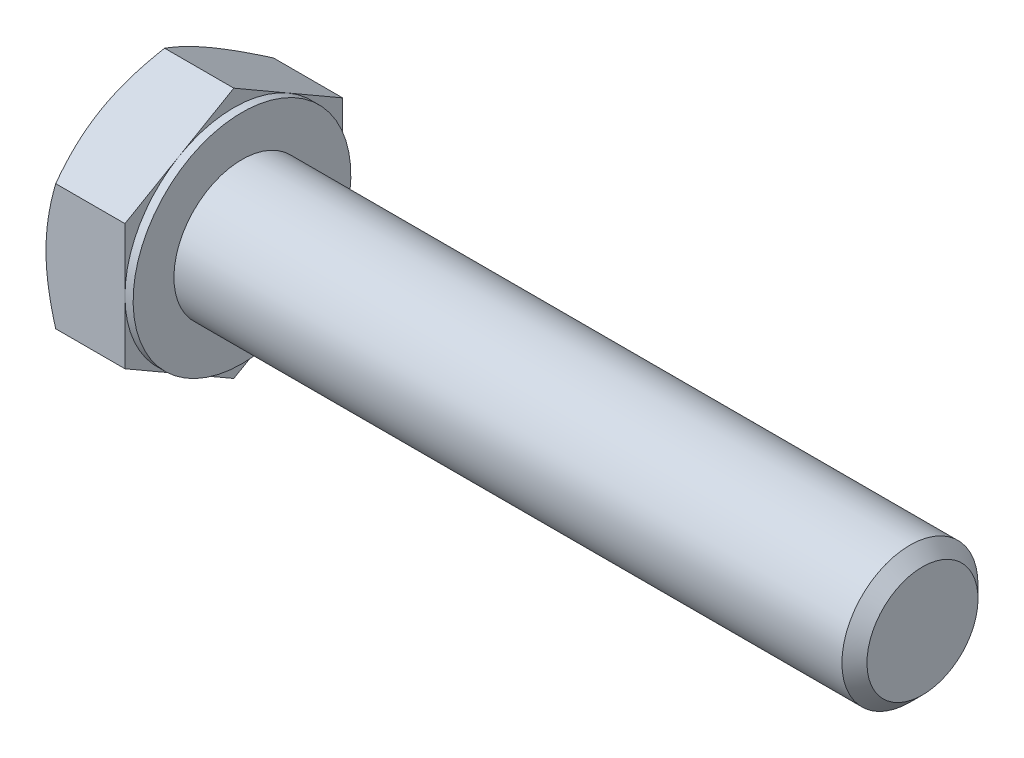
ISO-10303-21;
HEADER;
FILE_DESCRIPTION(('STEP AP214'),'2;1');
FILE_NAME('part.step','',(''),(''),'','','');
FILE_SCHEMA(('AUTOMOTIVE_DESIGN { 1 0 10303 214 1 1 1 1 }'));
ENDSEC;
DATA;
#1=APPLICATION_CONTEXT('core data for automotive mechanical design processes');
#2=APPLICATION_PROTOCOL_DEFINITION('international standard','automotive_design',2000,#1);
#3=PRODUCT_CONTEXT('',#1,'mechanical');
#4=PRODUCT('Part','Part','',(#3));
#5=PRODUCT_RELATED_PRODUCT_CATEGORY('part','',(#4));
#6=PRODUCT_DEFINITION_FORMATION('','',#4);
#7=PRODUCT_DEFINITION_CONTEXT('part definition',#1,'design');
#8=PRODUCT_DEFINITION('design','',#6,#7);
#9=PRODUCT_DEFINITION_SHAPE('','',#8);
#10=(LENGTH_UNIT() NAMED_UNIT(*) SI_UNIT(.MILLI.,.METRE.));
#11=(NAMED_UNIT(*) PLANE_ANGLE_UNIT() SI_UNIT($,.RADIAN.));
#12=(NAMED_UNIT(*) SI_UNIT($,.STERADIAN.) SOLID_ANGLE_UNIT());
#13=UNCERTAINTY_MEASURE_WITH_UNIT(LENGTH_MEASURE(1.E-05),#10,'distance_accuracy_value','');
#14=(GEOMETRIC_REPRESENTATION_CONTEXT(3) GLOBAL_UNCERTAINTY_ASSIGNED_CONTEXT((#13)) GLOBAL_UNIT_ASSIGNED_CONTEXT((#10,
#11,#12)) REPRESENTATION_CONTEXT('',''));
#15=CARTESIAN_POINT('',(0.,0.,0.));
#16=DIRECTION('',(0.,0.,1.));
#17=DIRECTION('',(1.,0.,0.));
#18=AXIS2_PLACEMENT_3D('',#15,#16,#17);
#19=CARTESIAN_POINT('',(0.,6.5,0.));
#20=DIRECTION('',(1.,0.,0.));
#21=DIRECTION('',(0.,1.,0.));
#22=AXIS2_PLACEMENT_3D('',#19,#20,#21);
#23=PLANE('',#22);
#24=CARTESIAN_POINT('',(0.,0.,0.));
#25=DIRECTION('',(1.,0.,0.));
#26=DIRECTION('',(0.,1.,0.));
#27=AXIS2_PLACEMENT_3D('',#24,#25,#26);
#28=CIRCLE('',#27,5.);
#29=CARTESIAN_POINT('',(0.,-5.,0.));
#30=VERTEX_POINT('',#29);
#31=EDGE_CURVE('E256',#30,#30,#28,.T.);
#32=ORIENTED_EDGE('',*,*,#31,.F.);
#33=EDGE_LOOP('',(#32));
#34=FACE_BOUND('',#33,.T.);
#35=CARTESIAN_POINT('',(0.,0.,0.));
#36=DIRECTION('',(1.,0.,0.));
#37=DIRECTION('',(0.,1.,0.));
#38=AXIS2_PLACEMENT_3D('',#35,#36,#37);
#39=CIRCLE('',#38,8.);
#40=CARTESIAN_POINT('',(0.,-8.,0.));
#41=VERTEX_POINT('',#40);
#42=EDGE_CURVE('E30',#41,#41,#39,.T.);
#43=ORIENTED_EDGE('',*,*,#42,.T.);
#44=EDGE_LOOP('',(#43));
#45=FACE_BOUND('',#44,.T.);
#46=ADVANCED_FACE('F17',(#34,#45),#23,.T.);
#47=CARTESIAN_POINT('',(-0.30005,0.,0.));
#48=DIRECTION('',(1.,0.,0.));
#49=DIRECTION('',(0.,1.,0.));
#50=AXIS2_PLACEMENT_3D('',#47,#48,#49);
#51=CYLINDRICAL_SURFACE('',#50,8.);
#52=ORIENTED_EDGE('',*,*,#42,.F.);
#53=DIRECTION('',(-1.,0.,0.));
#54=VECTOR('',#53,1.);
#55=CARTESIAN_POINT('',(-0.30005,-8.,0.));
#56=LINE('',#55,#54);
#57=CARTESIAN_POINT('',(-0.600099999999993,-8.,0.));
#58=VERTEX_POINT('',#57);
#59=EDGE_CURVE('E11',#41,#58,#56,.T.);
#60=ORIENTED_EDGE('',*,*,#59,.T.);
#61=CARTESIAN_POINT('',(-0.600099999999992,0.,0.));
#62=DIRECTION('',(1.,0.,0.));
#63=DIRECTION('',(0.,1.,0.));
#64=AXIS2_PLACEMENT_3D('',#61,#62,#63);
#65=CIRCLE('',#64,8.);
#66=CARTESIAN_POINT('',(-0.600099999999991,-6.9282032302755,-4.));
#67=VERTEX_POINT('',#66);
#68=EDGE_CURVE('E197',#58,#67,#65,.T.);
#69=ORIENTED_EDGE('',*,*,#68,.T.);
#70=CARTESIAN_POINT('',(-0.600099999999992,0.,0.));
#71=DIRECTION('',(1.,0.,0.));
#72=DIRECTION('',(0.,1.,0.));
#73=AXIS2_PLACEMENT_3D('',#70,#71,#72);
#74=CIRCLE('',#73,8.);
#75=CARTESIAN_POINT('',(-0.600099999999992,0.,-8.));
#76=VERTEX_POINT('',#75);
#77=EDGE_CURVE('E292',#67,#76,#74,.T.);
#78=ORIENTED_EDGE('',*,*,#77,.T.);
#79=CARTESIAN_POINT('',(-0.600099999999992,0.,0.));
#80=DIRECTION('',(1.,0.,0.));
#81=DIRECTION('',(0.,1.,0.));
#82=AXIS2_PLACEMENT_3D('',#79,#80,#81);
#83=CIRCLE('',#82,8.);
#84=CARTESIAN_POINT('',(-0.600099999999993,6.9282032302755,-4.));
#85=VERTEX_POINT('',#84);
#86=EDGE_CURVE('E361',#76,#85,#83,.T.);
#87=ORIENTED_EDGE('',*,*,#86,.T.);
#88=CARTESIAN_POINT('',(-0.600099999999992,0.,0.));
#89=DIRECTION('',(1.,0.,0.));
#90=DIRECTION('',(0.,1.,0.));
#91=AXIS2_PLACEMENT_3D('',#88,#89,#90);
#92=CIRCLE('',#91,8.);
#93=CARTESIAN_POINT('',(-0.600099999999993,6.9282032302755,4.));
#94=VERTEX_POINT('',#93);
#95=EDGE_CURVE('E174',#85,#94,#92,.T.);
#96=ORIENTED_EDGE('',*,*,#95,.T.);
#97=CARTESIAN_POINT('',(-0.600099999999992,0.,0.));
#98=DIRECTION('',(1.,0.,0.));
#99=DIRECTION('',(0.,1.,0.));
#100=AXIS2_PLACEMENT_3D('',#97,#98,#99);
#101=CIRCLE('',#100,8.);
#102=CARTESIAN_POINT('',(-0.600099999999992,0.,8.));
#103=VERTEX_POINT('',#102);
#104=EDGE_CURVE('E166',#94,#103,#101,.T.);
#105=ORIENTED_EDGE('',*,*,#104,.T.);
#106=CARTESIAN_POINT('',(-0.600099999999992,0.,0.));
#107=DIRECTION('',(1.,0.,0.));
#108=DIRECTION('',(0.,1.,0.));
#109=AXIS2_PLACEMENT_3D('',#106,#107,#108);
#110=CIRCLE('',#109,8.);
#111=CARTESIAN_POINT('',(-0.600099999999991,-6.92820323027551,4.));
#112=VERTEX_POINT('',#111);
#113=EDGE_CURVE('E179',#103,#112,#110,.T.);
#114=ORIENTED_EDGE('',*,*,#113,.T.);
#115=CARTESIAN_POINT('',(-0.600099999999992,0.,0.));
#116=DIRECTION('',(1.,0.,0.));
#117=DIRECTION('',(0.,1.,0.));
#118=AXIS2_PLACEMENT_3D('',#115,#116,#117);
#119=CIRCLE('',#118,8.);
#120=EDGE_CURVE('E249',#112,#58,#119,.T.);
#121=ORIENTED_EDGE('',*,*,#120,.T.);
#122=ORIENTED_EDGE('',*,*,#59,.F.);
#123=EDGE_LOOP('',(#52,#60,#69,#78,#87,#96,#105,#114,#121,#122));
#124=FACE_BOUND('',#123,.T.);
#125=ADVANCED_FACE('F177',(#124),#51,.T.);
#126=CARTESIAN_POINT('',(-6.4001,0.,0.));
#127=DIRECTION('',(1.,0.,0.));
#128=DIRECTION('',(0.,1.,0.));
#129=AXIS2_PLACEMENT_3D('',#126,#127,#128);
#130=PLANE('',#129);
#131=CARTESIAN_POINT('',(-6.4001,0.,0.));
#132=DIRECTION('',(-1.,0.,0.));
#133=DIRECTION('',(0.,1.,0.));
#134=AXIS2_PLACEMENT_3D('',#131,#132,#133);
#135=CIRCLE('',#134,8.);
#136=CARTESIAN_POINT('',(-6.4001,0.,8.));
#137=VERTEX_POINT('',#136);
#138=CARTESIAN_POINT('',(-6.4001,6.9282032302755,4.));
#139=VERTEX_POINT('',#138);
#140=EDGE_CURVE('E328',#137,#139,#135,.T.);
#141=ORIENTED_EDGE('',*,*,#140,.T.);
#142=CARTESIAN_POINT('',(-6.4001,0.,0.));
#143=DIRECTION('',(-1.,0.,0.));
#144=DIRECTION('',(0.,1.,0.));
#145=AXIS2_PLACEMENT_3D('',#142,#143,#144);
#146=CIRCLE('',#145,8.);
#147=CARTESIAN_POINT('',(-6.4001,6.9282032302755,-4.));
#148=VERTEX_POINT('',#147);
#149=EDGE_CURVE('E255',#139,#148,#146,.T.);
#150=ORIENTED_EDGE('',*,*,#149,.T.);
#151=CARTESIAN_POINT('',(-6.4001,0.,0.));
#152=DIRECTION('',(-1.,0.,0.));
#153=DIRECTION('',(0.,1.,0.));
#154=AXIS2_PLACEMENT_3D('',#151,#152,#153);
#155=CIRCLE('',#154,8.);
#156=CARTESIAN_POINT('',(-6.4001,0.,-8.));
#157=VERTEX_POINT('',#156);
#158=EDGE_CURVE('E299',#148,#157,#155,.T.);
#159=ORIENTED_EDGE('',*,*,#158,.T.);
#160=CARTESIAN_POINT('',(-6.4001,0.,0.));
#161=DIRECTION('',(-1.,0.,0.));
#162=DIRECTION('',(0.,1.,0.));
#163=AXIS2_PLACEMENT_3D('',#160,#161,#162);
#164=CIRCLE('',#163,8.);
#165=CARTESIAN_POINT('',(-6.4001,-6.9282032302755,-4.));
#166=VERTEX_POINT('',#165);
#167=EDGE_CURVE('E210',#157,#166,#164,.T.);
#168=ORIENTED_EDGE('',*,*,#167,.T.);
#169=CARTESIAN_POINT('',(-6.4001,0.,0.));
#170=DIRECTION('',(-1.,0.,0.));
#171=DIRECTION('',(0.,1.,0.));
#172=AXIS2_PLACEMENT_3D('',#169,#170,#171);
#173=CIRCLE('',#172,8.);
#174=CARTESIAN_POINT('',(-6.4001,-6.92820323027551,4.));
#175=VERTEX_POINT('',#174);
#176=EDGE_CURVE('E285',#166,#175,#173,.T.);
#177=ORIENTED_EDGE('',*,*,#176,.T.);
#178=CARTESIAN_POINT('',(-6.4001,0.,0.));
#179=DIRECTION('',(-1.,0.,0.));
#180=DIRECTION('',(0.,1.,0.));
#181=AXIS2_PLACEMENT_3D('',#178,#179,#180);
#182=CIRCLE('',#181,8.);
#183=EDGE_CURVE('E239',#175,#137,#182,.T.);
#184=ORIENTED_EDGE('',*,*,#183,.T.);
#185=EDGE_LOOP('',(#141,#150,#159,#168,#177,#184));
#186=FACE_BOUND('',#185,.T.);
#187=ADVANCED_FACE('F407',(#186),#130,.F.);
#188=CARTESIAN_POINT('',(-0.600099999999993,-9.237604307034,0.));
#189=DIRECTION('',(0.,-0.866025403784439,-0.5));
#190=DIRECTION('',(0.,0.5,-0.866025403784439));
#191=AXIS2_PLACEMENT_3D('',#188,#189,#190);
#192=PLANE('',#191);
#193=CARTESIAN_POINT('',(-6.4001,-6.9282032302755,-4.));
#194=CARTESIAN_POINT('',(-6.40010000000002,-5.85640646055103,-5.856406460551));
#195=CARTESIAN_POINT('',(-5.6855688201837,-4.61880215351702,-8.));
#196=(BOUNDED_CURVE() B_SPLINE_CURVE(2,(#193,#194,#195),.UNSPECIFIED.,.F.,
.F.) B_SPLINE_CURVE_WITH_KNOTS((3,3),(0.46856777502019,0.937135550040381),
.UNSPECIFIED.) CURVE() GEOMETRIC_REPRESENTATION_ITEM() RATIONAL_B_SPLINE_CURVE((1.,
1.03795484930206,1.)) REPRESENTATION_ITEM(''));
#197=CARTESIAN_POINT('',(-5.6855688201837,-4.61880215351701,-8.));
#198=VERTEX_POINT('',#197);
#199=EDGE_CURVE('E213',#166,#198,#196,.T.);
#200=ORIENTED_EDGE('',*,*,#199,.T.);
#201=DIRECTION('',(-1.,0.,0.));
#202=VECTOR('',#201,1.);
#203=CARTESIAN_POINT('',(-0.6001,-4.618802153517,-8.));
#204=LINE('',#203,#202);
#205=CARTESIAN_POINT('',(-0.6001,-4.618802153517,-8.));
#206=VERTEX_POINT('',#205);
#207=EDGE_CURVE('E276',#206,#198,#204,.T.);
#208=ORIENTED_EDGE('',*,*,#207,.F.);
#209=DIRECTION('',(0.,0.5,-0.866025403784439));
#210=VECTOR('',#209,1.);
#211=CARTESIAN_POINT('',(-0.600099999999993,-9.237604307034,0.));
#212=LINE('',#211,#210);
#213=EDGE_CURVE('E286',#67,#206,#212,.T.);
#214=ORIENTED_EDGE('',*,*,#213,.F.);
#215=DIRECTION('',(0.,0.5,-0.866025403784439));
#216=VECTOR('',#215,1.);
#217=CARTESIAN_POINT('',(-0.600099999999993,-9.237604307034,0.));
#218=LINE('',#217,#216);
#219=CARTESIAN_POINT('',(-0.600099999999993,-9.237604307034,0.));
#220=VERTEX_POINT('',#219);
#221=EDGE_CURVE('E204',#220,#67,#218,.T.);
#222=ORIENTED_EDGE('',*,*,#221,.F.);
#223=DIRECTION('',(-1.,0.,0.));
#224=VECTOR('',#223,1.);
#225=CARTESIAN_POINT('',(-0.600099999999993,-9.237604307034,0.));
#226=LINE('',#225,#224);
#227=CARTESIAN_POINT('',(-5.6855688201837,-9.23760430703399,0.));
#228=VERTEX_POINT('',#227);
#229=EDGE_CURVE('E222',#220,#228,#226,.T.);
#230=ORIENTED_EDGE('',*,*,#229,.T.);
#231=CARTESIAN_POINT('',(-5.6855688201837,-9.23760430703399,0.));
#232=CARTESIAN_POINT('',(-6.40010000000002,-7.99999999999998,-2.14359353944901));
#233=CARTESIAN_POINT('',(-6.4001,-6.9282032302755,-4.));
#234=(BOUNDED_CURVE() B_SPLINE_CURVE(2,(#231,#232,#233),.UNSPECIFIED.,.F.,
.F.) B_SPLINE_CURVE_WITH_KNOTS((3,3),(0.,0.46856777502019),
.UNSPECIFIED.) CURVE() GEOMETRIC_REPRESENTATION_ITEM() RATIONAL_B_SPLINE_CURVE((1.,
1.03795484930205,1.)) REPRESENTATION_ITEM(''));
#235=EDGE_CURVE('E214',#228,#166,#234,.T.);
#236=ORIENTED_EDGE('',*,*,#235,.T.);
#237=EDGE_LOOP('',(#200,#208,#214,#222,#230,#236));
#238=FACE_BOUND('',#237,.T.);
#239=ADVANCED_FACE('F556',(#238),#192,.T.);
#240=CARTESIAN_POINT('',(-0.6001,-4.61880215351701,8.));
#241=DIRECTION('',(0.,-0.866025403784439,0.5));
#242=DIRECTION('',(-1.,0.,0.));
#243=AXIS2_PLACEMENT_3D('',#240,#241,#242);
#244=PLANE('',#243);
#245=CARTESIAN_POINT('',(-6.4001,-6.92820323027551,4.));
#246=CARTESIAN_POINT('',(-6.40010000000001,-7.99999999999999,2.14359353944899));
#247=CARTESIAN_POINT('',(-5.6855688201837,-9.23760430703399,0.));
#248=(BOUNDED_CURVE() B_SPLINE_CURVE(2,(#245,#246,#247),.UNSPECIFIED.,.F.,
.F.) B_SPLINE_CURVE_WITH_KNOTS((3,3),(0.468567775020191,0.937135550040381),
.UNSPECIFIED.) CURVE() GEOMETRIC_REPRESENTATION_ITEM() RATIONAL_B_SPLINE_CURVE((1.,
1.03795484930203,1.)) REPRESENTATION_ITEM(''));
#249=EDGE_CURVE('E220',#175,#228,#248,.T.);
#250=ORIENTED_EDGE('',*,*,#249,.T.);
#251=ORIENTED_EDGE('',*,*,#229,.F.);
#252=DIRECTION('',(0.,-0.5,-0.866025403784439));
#253=VECTOR('',#252,1.);
#254=CARTESIAN_POINT('',(-0.6001,-4.61880215351701,8.));
#255=LINE('',#254,#253);
#256=EDGE_CURVE('E208',#112,#220,#255,.T.);
#257=ORIENTED_EDGE('',*,*,#256,.F.);
#258=DIRECTION('',(0.,-0.5,-0.866025403784439));
#259=VECTOR('',#258,1.);
#260=CARTESIAN_POINT('',(-0.6001,-4.61880215351701,8.));
#261=LINE('',#260,#259);
#262=CARTESIAN_POINT('',(-0.6001,-4.61880215351701,8.));
#263=VERTEX_POINT('',#262);
#264=EDGE_CURVE('E183',#263,#112,#261,.T.);
#265=ORIENTED_EDGE('',*,*,#264,.F.);
#266=DIRECTION('',(-1.,0.,0.));
#267=VECTOR('',#266,1.);
#268=CARTESIAN_POINT('',(-0.6001,-4.61880215351701,8.));
#269=LINE('',#268,#267);
#270=CARTESIAN_POINT('',(-5.6855688201837,-4.61880215351698,8.));
#271=VERTEX_POINT('',#270);
#272=EDGE_CURVE('E190',#263,#271,#269,.T.);
#273=ORIENTED_EDGE('',*,*,#272,.T.);
#274=CARTESIAN_POINT('',(-5.6855688201837,-4.61880215351703,8.));
#275=CARTESIAN_POINT('',(-6.40010000000001,-5.85640646055102,5.85640646055101));
#276=CARTESIAN_POINT('',(-6.4001,-6.92820323027551,4.));
#277=(BOUNDED_CURVE() B_SPLINE_CURVE(2,(#274,#275,#276),.UNSPECIFIED.,.F.,
.F.) B_SPLINE_CURVE_WITH_KNOTS((3,3),(0.,0.468567775020191),
.UNSPECIFIED.) CURVE() GEOMETRIC_REPRESENTATION_ITEM() RATIONAL_B_SPLINE_CURVE((1.,
1.03795484930205,1.)) REPRESENTATION_ITEM(''));
#278=EDGE_CURVE('E319',#271,#175,#277,.T.);
#279=ORIENTED_EDGE('',*,*,#278,.T.);
#280=EDGE_LOOP('',(#250,#251,#257,#265,#273,#279));
#281=FACE_BOUND('',#280,.T.);
#282=ADVANCED_FACE('F571',(#281),#244,.T.);
#283=CARTESIAN_POINT('',(-0.6001,4.618802153517,8.));
#284=DIRECTION('',(0.,0.,1.));
#285=DIRECTION('',(0.,-1.,0.));
#286=AXIS2_PLACEMENT_3D('',#283,#284,#285);
#287=PLANE('',#286);
#288=CARTESIAN_POINT('',(-6.4001,0.,8.));
#289=CARTESIAN_POINT('',(-6.40010000000001,-2.14359353944897,7.99999999999999));
#290=CARTESIAN_POINT('',(-5.6855688201837,-4.61880215351698,8.));
#291=(BOUNDED_CURVE() B_SPLINE_CURVE(2,(#288,#289,#290),.UNSPECIFIED.,.F.,
.F.) B_SPLINE_CURVE_WITH_KNOTS((3,3),(0.468567775020191,0.937135550040382),
.UNSPECIFIED.) CURVE() GEOMETRIC_REPRESENTATION_ITEM() RATIONAL_B_SPLINE_CURVE((1.,
1.03795484930205,1.)) REPRESENTATION_ITEM(''));
#292=EDGE_CURVE('E242',#137,#271,#291,.T.);
#293=ORIENTED_EDGE('',*,*,#292,.T.);
#294=ORIENTED_EDGE('',*,*,#272,.F.);
#295=DIRECTION('',(0.,-1.,0.));
#296=VECTOR('',#295,1.);
#297=CARTESIAN_POINT('',(-0.6001,4.618802153517,8.));
#298=LINE('',#297,#296);
#299=EDGE_CURVE('E186',#103,#263,#298,.T.);
#300=ORIENTED_EDGE('',*,*,#299,.F.);
#301=DIRECTION('',(0.,-1.,0.));
#302=VECTOR('',#301,1.);
#303=CARTESIAN_POINT('',(-0.6001,4.618802153517,8.));
#304=LINE('',#303,#302);
#305=CARTESIAN_POINT('',(-0.6001,4.618802153517,8.));
#306=VERTEX_POINT('',#305);
#307=EDGE_CURVE('E163',#306,#103,#304,.T.);
#308=ORIENTED_EDGE('',*,*,#307,.F.);
#309=DIRECTION('',(-1.,0.,0.));
#310=VECTOR('',#309,1.);
#311=CARTESIAN_POINT('',(-0.6001,4.618802153517,8.));
#312=LINE('',#311,#310);
#313=CARTESIAN_POINT('',(-5.6855688201837,4.61880215351697,8.));
#314=VERTEX_POINT('',#313);
#315=EDGE_CURVE('E311',#306,#314,#312,.T.);
#316=ORIENTED_EDGE('',*,*,#315,.T.);
#317=CARTESIAN_POINT('',(-5.6855688201837,4.61880215351696,8.));
#318=CARTESIAN_POINT('',(-6.40010000000001,2.14359353944896,8.));
#319=CARTESIAN_POINT('',(-6.4001,0.,8.));
#320=(BOUNDED_CURVE() B_SPLINE_CURVE(2,(#317,#318,#319),.UNSPECIFIED.,.F.,
.F.) B_SPLINE_CURVE_WITH_KNOTS((3,3),(0.,0.468567775020191),
.UNSPECIFIED.) CURVE() GEOMETRIC_REPRESENTATION_ITEM() RATIONAL_B_SPLINE_CURVE((1.,
1.03795484930204,1.)) REPRESENTATION_ITEM(''));
#321=EDGE_CURVE('E335',#314,#137,#320,.T.);
#322=ORIENTED_EDGE('',*,*,#321,.T.);
#323=EDGE_LOOP('',(#293,#294,#300,#308,#316,#322));
#324=FACE_BOUND('',#323,.T.);
#325=ADVANCED_FACE('F188',(#324),#287,.T.);
#326=CARTESIAN_POINT('',(-0.6001,0.,0.));
#327=DIRECTION('',(1.,0.,0.));
#328=DIRECTION('',(0.,1.,0.));
#329=AXIS2_PLACEMENT_3D('',#326,#327,#328);
#330=PLANE('',#329);
#331=ORIENTED_EDGE('',*,*,#77,.F.);
#332=ORIENTED_EDGE('',*,*,#213,.T.);
#333=DIRECTION('',(0.,1.,0.));
#334=VECTOR('',#333,1.);
#335=CARTESIAN_POINT('',(-0.6001,-4.618802153517,-8.));
#336=LINE('',#335,#334);
#337=EDGE_CURVE('E238',#206,#76,#336,.T.);
#338=ORIENTED_EDGE('',*,*,#337,.T.);
#339=EDGE_LOOP('',(#331,#332,#338));
#340=FACE_BOUND('',#339,.T.);
#341=ADVANCED_FACE('F519',(#340),#330,.T.);
#342=CARTESIAN_POINT('',(-0.6001,0.,0.));
#343=DIRECTION('',(1.,0.,0.));
#344=DIRECTION('',(0.,1.,0.));
#345=AXIS2_PLACEMENT_3D('',#342,#343,#344);
#346=PLANE('',#345);
#347=ORIENTED_EDGE('',*,*,#86,.F.);
#348=DIRECTION('',(0.,1.,0.));
#349=VECTOR('',#348,1.);
#350=CARTESIAN_POINT('',(-0.6001,-4.618802153517,-8.));
#351=LINE('',#350,#349);
#352=CARTESIAN_POINT('',(-0.6001,4.618802153517,-8.));
#353=VERTEX_POINT('',#352);
#354=EDGE_CURVE('E234',#76,#353,#351,.T.);
#355=ORIENTED_EDGE('',*,*,#354,.T.);
#356=DIRECTION('',(0.,0.5,0.866025403784439));
#357=VECTOR('',#356,1.);
#358=CARTESIAN_POINT('',(-0.6001,4.618802153517,-8.));
#359=LINE('',#358,#357);
#360=EDGE_CURVE('E314',#353,#85,#359,.T.);
#361=ORIENTED_EDGE('',*,*,#360,.T.);
#362=EDGE_LOOP('',(#347,#355,#361));
#363=FACE_BOUND('',#362,.T.);
#364=ADVANCED_FACE('F456',(#363),#346,.T.);
#365=CARTESIAN_POINT('',(-0.6001,0.,0.));
#366=DIRECTION('',(1.,0.,0.));
#367=DIRECTION('',(0.,1.,0.));
#368=AXIS2_PLACEMENT_3D('',#365,#366,#367);
#369=PLANE('',#368);
#370=ORIENTED_EDGE('',*,*,#95,.F.);
#371=DIRECTION('',(0.,0.5,0.866025403784439));
#372=VECTOR('',#371,1.);
#373=CARTESIAN_POINT('',(-0.6001,4.618802153517,-8.));
#374=LINE('',#373,#372);
#375=CARTESIAN_POINT('',(-0.6001,9.237604307034,0.));
#376=VERTEX_POINT('',#375);
#377=EDGE_CURVE('E346',#85,#376,#374,.T.);
#378=ORIENTED_EDGE('',*,*,#377,.T.);
#379=DIRECTION('',(0.,-0.5,0.866025403784438));
#380=VECTOR('',#379,1.);
#381=CARTESIAN_POINT('',(-0.6001,9.237604307034,0.));
#382=LINE('',#381,#380);
#383=EDGE_CURVE('E246',#376,#94,#382,.T.);
#384=ORIENTED_EDGE('',*,*,#383,.T.);
#385=EDGE_LOOP('',(#370,#378,#384));
#386=FACE_BOUND('',#385,.T.);
#387=ADVANCED_FACE('F19',(#386),#369,.T.);
#388=CARTESIAN_POINT('',(-0.6001,0.,0.));
#389=DIRECTION('',(1.,0.,0.));
#390=DIRECTION('',(0.,1.,0.));
#391=AXIS2_PLACEMENT_3D('',#388,#389,#390);
#392=PLANE('',#391);
#393=ORIENTED_EDGE('',*,*,#104,.F.);
#394=DIRECTION('',(0.,-0.5,0.866025403784438));
#395=VECTOR('',#394,1.);
#396=CARTESIAN_POINT('',(-0.6001,9.237604307034,0.));
#397=LINE('',#396,#395);
#398=EDGE_CURVE('E169',#94,#306,#397,.T.);
#399=ORIENTED_EDGE('',*,*,#398,.T.);
#400=ORIENTED_EDGE('',*,*,#307,.T.);
#401=EDGE_LOOP('',(#393,#399,#400));
#402=FACE_BOUND('',#401,.T.);
#403=ADVANCED_FACE('F165',(#402),#392,.T.);
#404=CARTESIAN_POINT('',(-0.6001,0.,0.));
#405=DIRECTION('',(1.,0.,0.));
#406=DIRECTION('',(0.,1.,0.));
#407=AXIS2_PLACEMENT_3D('',#404,#405,#406);
#408=PLANE('',#407);
#409=ORIENTED_EDGE('',*,*,#113,.F.);
#410=ORIENTED_EDGE('',*,*,#299,.T.);
#411=ORIENTED_EDGE('',*,*,#264,.T.);
#412=EDGE_LOOP('',(#409,#410,#411));
#413=FACE_BOUND('',#412,.T.);
#414=ADVANCED_FACE('F195',(#413),#408,.T.);
#415=CARTESIAN_POINT('',(-0.6001,0.,0.));
#416=DIRECTION('',(1.,0.,0.));
#417=DIRECTION('',(0.,1.,0.));
#418=AXIS2_PLACEMENT_3D('',#415,#416,#417);
#419=PLANE('',#418);
#420=ORIENTED_EDGE('',*,*,#120,.F.);
#421=ORIENTED_EDGE('',*,*,#256,.T.);
#422=ORIENTED_EDGE('',*,*,#221,.T.);
#423=ORIENTED_EDGE('',*,*,#68,.F.);
#424=EDGE_LOOP('',(#420,#421,#422,#423));
#425=FACE_BOUND('',#424,.T.);
#426=ADVANCED_FACE('F413',(#425),#419,.T.);
#427=CARTESIAN_POINT('',(-0.6001,9.237604307034,0.));
#428=DIRECTION('',(0.,0.866025403784438,0.5));
#429=DIRECTION('',(1.,0.,0.));
#430=AXIS2_PLACEMENT_3D('',#427,#428,#429);
#431=PLANE('',#430);
#432=CARTESIAN_POINT('',(-5.6855688201837,9.23760430703399,0.));
#433=CARTESIAN_POINT('',(-6.40010000000001,7.99999999999999,2.143593539449));
#434=CARTESIAN_POINT('',(-6.4001,6.9282032302755,4.));
#435=(BOUNDED_CURVE() B_SPLINE_CURVE(2,(#432,#433,#434),.UNSPECIFIED.,.F.,
.F.) B_SPLINE_CURVE_WITH_KNOTS((3,3),(0.,0.46856777502019),
.UNSPECIFIED.) CURVE() GEOMETRIC_REPRESENTATION_ITEM() RATIONAL_B_SPLINE_CURVE((1.,
1.03795484930204,1.)) REPRESENTATION_ITEM(''));
#436=CARTESIAN_POINT('',(-5.6855688201837,9.23760430703399,0.));
#437=VERTEX_POINT('',#436);
#438=EDGE_CURVE('E221',#437,#139,#435,.T.);
#439=ORIENTED_EDGE('',*,*,#438,.T.);
#440=CARTESIAN_POINT('',(-6.4001,6.9282032302755,4.));
#441=CARTESIAN_POINT('',(-6.40010000000001,5.85640646055102,5.856406460551));
#442=CARTESIAN_POINT('',(-5.6855688201837,4.61880215351702,8.));
#443=(BOUNDED_CURVE() B_SPLINE_CURVE(2,(#440,#441,#442),.UNSPECIFIED.,.F.,
.F.) B_SPLINE_CURVE_WITH_KNOTS((3,3),(0.46856777502019,0.937135550040381),
.UNSPECIFIED.) CURVE() GEOMETRIC_REPRESENTATION_ITEM() RATIONAL_B_SPLINE_CURVE((1.,
1.03795484930203,1.)) REPRESENTATION_ITEM(''));
#444=EDGE_CURVE('E21',#139,#314,#443,.T.);
#445=ORIENTED_EDGE('',*,*,#444,.T.);
#446=ORIENTED_EDGE('',*,*,#315,.F.);
#447=ORIENTED_EDGE('',*,*,#398,.F.);
#448=ORIENTED_EDGE('',*,*,#383,.F.);
#449=DIRECTION('',(-1.,0.,0.));
#450=VECTOR('',#449,1.);
#451=CARTESIAN_POINT('',(-0.6001,9.237604307034,0.));
#452=LINE('',#451,#450);
#453=EDGE_CURVE('E350',#376,#437,#452,.T.);
#454=ORIENTED_EDGE('',*,*,#453,.T.);
#455=EDGE_LOOP('',(#439,#445,#446,#447,#448,#454));
#456=FACE_BOUND('',#455,.T.);
#457=ADVANCED_FACE('F429',(#456),#431,.T.);
#458=CARTESIAN_POINT('',(-0.6001,4.618802153517,-8.));
#459=DIRECTION('',(0.,0.866025403784439,-0.5));
#460=DIRECTION('',(-1.,0.,0.));
#461=AXIS2_PLACEMENT_3D('',#458,#459,#460);
#462=PLANE('',#461);
#463=CARTESIAN_POINT('',(-5.6855688201837,4.61880215351702,-8.));
#464=CARTESIAN_POINT('',(-6.40010000000002,5.85640646055102,-5.856406460551));
#465=CARTESIAN_POINT('',(-6.4001,6.9282032302755,-4.));
#466=(BOUNDED_CURVE() B_SPLINE_CURVE(2,(#463,#464,#465),.UNSPECIFIED.,.F.,
.F.) B_SPLINE_CURVE_WITH_KNOTS((3,3),(0.,0.468567775020191),
.UNSPECIFIED.) CURVE() GEOMETRIC_REPRESENTATION_ITEM() RATIONAL_B_SPLINE_CURVE((1.,
1.03795484930204,1.)) REPRESENTATION_ITEM(''));
#467=CARTESIAN_POINT('',(-5.6855688201837,4.61880215351698,-8.));
#468=VERTEX_POINT('',#467);
#469=EDGE_CURVE('E269',#468,#148,#466,.T.);
#470=ORIENTED_EDGE('',*,*,#469,.T.);
#471=CARTESIAN_POINT('',(-6.4001,6.9282032302755,-4.));
#472=CARTESIAN_POINT('',(-6.40010000000002,7.99999999999999,-2.14359353944899));
#473=CARTESIAN_POINT('',(-5.6855688201837,9.23760430703399,0.));
#474=(BOUNDED_CURVE() B_SPLINE_CURVE(2,(#471,#472,#473),.UNSPECIFIED.,.F.,
.F.) B_SPLINE_CURVE_WITH_KNOTS((3,3),(0.468567775020191,0.937135550040382),
.UNSPECIFIED.) CURVE() GEOMETRIC_REPRESENTATION_ITEM() RATIONAL_B_SPLINE_CURVE((1.,
1.03795484930204,1.)) REPRESENTATION_ITEM(''));
#475=EDGE_CURVE('E241',#148,#437,#474,.T.);
#476=ORIENTED_EDGE('',*,*,#475,.T.);
#477=ORIENTED_EDGE('',*,*,#453,.F.);
#478=ORIENTED_EDGE('',*,*,#377,.F.);
#479=ORIENTED_EDGE('',*,*,#360,.F.);
#480=DIRECTION('',(-1.,0.,0.));
#481=VECTOR('',#480,1.);
#482=CARTESIAN_POINT('',(-0.6001,4.618802153517,-8.));
#483=LINE('',#482,#481);
#484=EDGE_CURVE('E212',#353,#468,#483,.T.);
#485=ORIENTED_EDGE('',*,*,#484,.T.);
#486=EDGE_LOOP('',(#470,#476,#477,#478,#479,#485));
#487=FACE_BOUND('',#486,.T.);
#488=ADVANCED_FACE('F421',(#487),#462,.T.);
#489=CARTESIAN_POINT('',(-0.6001,-4.618802153517,-8.));
#490=DIRECTION('',(0.,0.,-1.));
#491=DIRECTION('',(-1.,0.,0.));
#492=AXIS2_PLACEMENT_3D('',#489,#490,#491);
#493=PLANE('',#492);
#494=CARTESIAN_POINT('',(-5.6855688201837,-4.61880215351697,-8.));
#495=CARTESIAN_POINT('',(-6.40010000000001,-2.14359353944896,-8.));
#496=CARTESIAN_POINT('',(-6.4001,0.,-8.));
#497=(BOUNDED_CURVE() B_SPLINE_CURVE(2,(#494,#495,#496),.UNSPECIFIED.,.F.,
.F.) B_SPLINE_CURVE_WITH_KNOTS((3,3),(0.,0.468567775020191),
.UNSPECIFIED.) CURVE() GEOMETRIC_REPRESENTATION_ITEM() RATIONAL_B_SPLINE_CURVE((1.,
1.03795484930203,1.)) REPRESENTATION_ITEM(''));
#498=EDGE_CURVE('E263',#198,#157,#497,.T.);
#499=ORIENTED_EDGE('',*,*,#498,.T.);
#500=CARTESIAN_POINT('',(-6.4001,0.,-8.));
#501=CARTESIAN_POINT('',(-6.40010000000001,2.14359353944897,-7.99999999999999));
#502=CARTESIAN_POINT('',(-5.6855688201837,4.61880215351697,-8.));
#503=(BOUNDED_CURVE() B_SPLINE_CURVE(2,(#500,#501,#502),.UNSPECIFIED.,.F.,
.F.) B_SPLINE_CURVE_WITH_KNOTS((3,3),(0.468567775020191,0.937135550040381),
.UNSPECIFIED.) CURVE() GEOMETRIC_REPRESENTATION_ITEM() RATIONAL_B_SPLINE_CURVE((1.,
1.03795484930203,1.)) REPRESENTATION_ITEM(''));
#504=EDGE_CURVE('E293',#157,#468,#503,.T.);
#505=ORIENTED_EDGE('',*,*,#504,.T.);
#506=ORIENTED_EDGE('',*,*,#484,.F.);
#507=ORIENTED_EDGE('',*,*,#354,.F.);
#508=ORIENTED_EDGE('',*,*,#337,.F.);
#509=ORIENTED_EDGE('',*,*,#207,.T.);
#510=EDGE_LOOP('',(#499,#505,#506,#507,#508,#509));
#511=FACE_BOUND('',#510,.T.);
#512=ADVANCED_FACE('F418',(#511),#493,.T.);
#513=CARTESIAN_POINT('',(-6.04283441009185,0.,0.));
#514=DIRECTION('',(1.,0.,0.));
#515=DIRECTION('',(0.,1.,0.));
#516=AXIS2_PLACEMENT_3D('',#513,#514,#515);
#517=CONICAL_SURFACE('',#516,8.618802153517,1.0471975511966);
#518=ORIENTED_EDGE('',*,*,#498,.F.);
#519=ORIENTED_EDGE('',*,*,#199,.F.);
#520=ORIENTED_EDGE('',*,*,#167,.F.);
#521=EDGE_LOOP('',(#518,#519,#520));
#522=FACE_BOUND('',#521,.T.);
#523=ADVANCED_FACE('F420',(#522),#517,.T.);
#524=CARTESIAN_POINT('',(-6.04283441009185,0.,0.));
#525=DIRECTION('',(1.,0.,0.));
#526=DIRECTION('',(0.,1.,0.));
#527=AXIS2_PLACEMENT_3D('',#524,#525,#526);
#528=CONICAL_SURFACE('',#527,8.618802153517,1.0471975511966);
#529=ORIENTED_EDGE('',*,*,#504,.F.);
#530=ORIENTED_EDGE('',*,*,#158,.F.);
#531=ORIENTED_EDGE('',*,*,#469,.F.);
#532=EDGE_LOOP('',(#529,#530,#531));
#533=FACE_BOUND('',#532,.T.);
#534=ADVANCED_FACE('F427',(#533),#528,.T.);
#535=CARTESIAN_POINT('',(-6.04283441009185,0.,0.));
#536=DIRECTION('',(1.,0.,0.));
#537=DIRECTION('',(0.,-1.,0.));
#538=AXIS2_PLACEMENT_3D('',#535,#536,#537);
#539=CONICAL_SURFACE('',#538,8.618802153517,1.0471975511966);
#540=ORIENTED_EDGE('',*,*,#235,.F.);
#541=ORIENTED_EDGE('',*,*,#249,.F.);
#542=ORIENTED_EDGE('',*,*,#176,.F.);
#543=EDGE_LOOP('',(#540,#541,#542));
#544=FACE_BOUND('',#543,.T.);
#545=ADVANCED_FACE('F473',(#544),#539,.T.);
#546=CARTESIAN_POINT('',(-6.04283441009185,0.,0.));
#547=DIRECTION('',(1.,0.,0.));
#548=DIRECTION('',(0.,1.,0.));
#549=AXIS2_PLACEMENT_3D('',#546,#547,#548);
#550=CONICAL_SURFACE('',#549,8.618802153517,1.0471975511966);
#551=ORIENTED_EDGE('',*,*,#475,.F.);
#552=ORIENTED_EDGE('',*,*,#149,.F.);
#553=ORIENTED_EDGE('',*,*,#438,.F.);
#554=EDGE_LOOP('',(#551,#552,#553));
#555=FACE_BOUND('',#554,.T.);
#556=ADVANCED_FACE('F416',(#555),#550,.T.);
#557=CARTESIAN_POINT('',(-6.04283441009185,0.,0.));
#558=DIRECTION('',(1.,0.,0.));
#559=DIRECTION('',(0.,1.,0.));
#560=AXIS2_PLACEMENT_3D('',#557,#558,#559);
#561=CONICAL_SURFACE('',#560,8.618802153517,1.0471975511966);
#562=ORIENTED_EDGE('',*,*,#278,.F.);
#563=ORIENTED_EDGE('',*,*,#292,.F.);
#564=ORIENTED_EDGE('',*,*,#183,.F.);
#565=EDGE_LOOP('',(#562,#563,#564));
#566=FACE_BOUND('',#565,.T.);
#567=ADVANCED_FACE('F396',(#566),#561,.T.);
#568=CARTESIAN_POINT('',(-6.04283441009185,0.,0.));
#569=DIRECTION('',(1.,0.,0.));
#570=DIRECTION('',(0.,1.,0.));
#571=AXIS2_PLACEMENT_3D('',#568,#569,#570);
#572=CONICAL_SURFACE('',#571,8.618802153517,1.0471975511966);
#573=ORIENTED_EDGE('',*,*,#444,.F.);
#574=ORIENTED_EDGE('',*,*,#140,.F.);
#575=ORIENTED_EDGE('',*,*,#321,.F.);
#576=EDGE_LOOP('',(#573,#574,#575));
#577=FACE_BOUND('',#576,.T.);
#578=ADVANCED_FACE('F387',(#577),#572,.T.);
#579=CARTESIAN_POINT('',(50.,2.5,0.));
#580=DIRECTION('',(1.,0.,0.));
#581=DIRECTION('',(0.,1.,0.));
#582=AXIS2_PLACEMENT_3D('',#579,#580,#581);
#583=PLANE('',#582);
#584=CARTESIAN_POINT('',(50.,0.,0.));
#585=DIRECTION('',(-1.,0.,0.));
#586=DIRECTION('',(0.,-1.,0.));
#587=AXIS2_PLACEMENT_3D('',#584,#585,#586);
#588=CIRCLE('',#587,4.079825);
#589=CARTESIAN_POINT('',(50.,4.079825,0.));
#590=VERTEX_POINT('',#589);
#591=EDGE_CURVE('E231',#590,#590,#588,.T.);
#592=ORIENTED_EDGE('',*,*,#591,.F.);
#593=EDGE_LOOP('',(#592));
#594=FACE_BOUND('',#593,.T.);
#595=ADVANCED_FACE('F384',(#594),#583,.T.);
#596=CARTESIAN_POINT('',(27.25,0.,0.));
#597=DIRECTION('',(1.,0.,0.));
#598=DIRECTION('',(0.,1.,0.));
#599=AXIS2_PLACEMENT_3D('',#596,#597,#598);
#600=CYLINDRICAL_SURFACE('',#599,5.);
#601=CARTESIAN_POINT('',(49.079725,0.,0.));
#602=DIRECTION('',(1.,0.,0.));
#603=DIRECTION('',(0.,-1.,0.));
#604=AXIS2_PLACEMENT_3D('',#601,#602,#603);
#605=CIRCLE('',#604,5.);
#606=CARTESIAN_POINT('',(49.079725,5.,0.));
#607=VERTEX_POINT('',#606);
#608=CARTESIAN_POINT('',(49.079725,-5.,0.));
#609=VERTEX_POINT('',#608);
#610=EDGE_CURVE('E228',#607,#609,#605,.T.);
#611=ORIENTED_EDGE('',*,*,#610,.F.);
#612=CARTESIAN_POINT('',(49.079725,0.,0.));
#613=DIRECTION('',(1.,0.,0.));
#614=DIRECTION('',(0.,-1.,0.));
#615=AXIS2_PLACEMENT_3D('',#612,#613,#614);
#616=CIRCLE('',#615,5.);
#617=EDGE_CURVE('E125',#609,#607,#616,.T.);
#618=ORIENTED_EDGE('',*,*,#617,.F.);
#619=DIRECTION('',(-1.,0.,0.));
#620=VECTOR('',#619,1.);
#621=CARTESIAN_POINT('',(27.25,-5.,0.));
#622=LINE('',#621,#620);
#623=EDGE_CURVE('E262',#609,#30,#622,.T.);
#624=ORIENTED_EDGE('',*,*,#623,.T.);
#625=ORIENTED_EDGE('',*,*,#31,.T.);
#626=ORIENTED_EDGE('',*,*,#623,.F.);
#627=EDGE_LOOP('',(#611,#618,#624,#625,#626));
#628=FACE_BOUND('',#627,.T.);
#629=ADVANCED_FACE('F386',(#628),#600,.T.);
#630=CARTESIAN_POINT('',(49.5398625,0.,0.));
#631=DIRECTION('',(-1.,0.,0.));
#632=DIRECTION('',(0.,-1.,0.));
#633=AXIS2_PLACEMENT_3D('',#630,#631,#632);
#634=CONICAL_SURFACE('',#633,4.5399125,0.785343828859751);
#635=ORIENTED_EDGE('',*,*,#591,.T.);
#636=DIRECTION('',(-0.707145200462813,0.707068359822732,0.));
#637=VECTOR('',#636,1.);
#638=CARTESIAN_POINT('',(49.5398625,4.53991250000001,0.));
#639=LINE('',#638,#637);
#640=EDGE_CURVE('E117',#590,#607,#639,.T.);
#641=ORIENTED_EDGE('',*,*,#640,.T.);
#642=ORIENTED_EDGE('',*,*,#610,.T.);
#643=ORIENTED_EDGE('',*,*,#617,.T.);
#644=ORIENTED_EDGE('',*,*,#640,.F.);
#645=EDGE_LOOP('',(#635,#641,#642,#643,#644));
#646=FACE_BOUND('',#645,.T.);
#647=ADVANCED_FACE('F381',(#646),#634,.T.);
#648=CLOSED_SHELL('',(#46,#125,#187,#239,#282,#325,#341,#364,#387,#403,#414,#426,#457,#488,#512,
#523,#534,#545,#556,#567,#578,#595,#629,#647));
#649=MANIFOLD_SOLID_BREP('B1',#648);
#650=ADVANCED_BREP_SHAPE_REPRESENTATION('',(#18,#649),#14);
#651=SHAPE_DEFINITION_REPRESENTATION(#9,#650);
ENDSEC;
END-ISO-10303-21;
